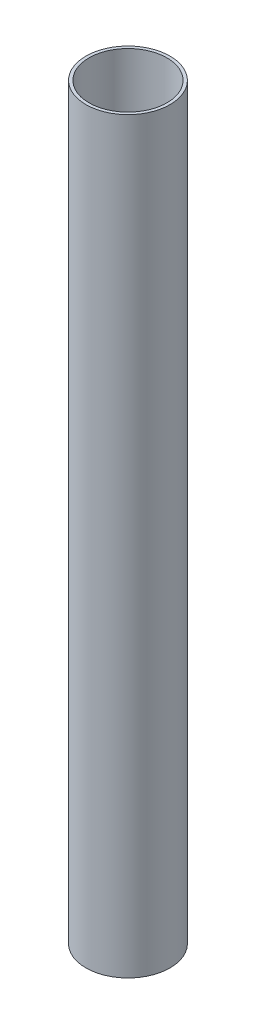
ISO-10303-21;
HEADER;
FILE_DESCRIPTION(('STEP AP214'),'2;1');
FILE_NAME('part.step','',(''),(''),'','','');
FILE_SCHEMA(('AUTOMOTIVE_DESIGN { 1 0 10303 214 1 1 1 1 }'));
ENDSEC;
DATA;
#1=APPLICATION_CONTEXT('core data for automotive mechanical design processes');
#2=APPLICATION_PROTOCOL_DEFINITION('international standard','automotive_design',2000,#1);
#3=PRODUCT_CONTEXT('',#1,'mechanical');
#4=PRODUCT('Part','Part','',(#3));
#5=PRODUCT_RELATED_PRODUCT_CATEGORY('part','',(#4));
#6=PRODUCT_DEFINITION_FORMATION('','',#4);
#7=PRODUCT_DEFINITION_CONTEXT('part definition',#1,'design');
#8=PRODUCT_DEFINITION('design','',#6,#7);
#9=PRODUCT_DEFINITION_SHAPE('','',#8);
#10=(LENGTH_UNIT() NAMED_UNIT(*) SI_UNIT(.MILLI.,.METRE.));
#11=(NAMED_UNIT(*) PLANE_ANGLE_UNIT() SI_UNIT($,.RADIAN.));
#12=(NAMED_UNIT(*) SI_UNIT($,.STERADIAN.) SOLID_ANGLE_UNIT());
#13=UNCERTAINTY_MEASURE_WITH_UNIT(LENGTH_MEASURE(1.E-05),#10,'distance_accuracy_value','');
#14=(GEOMETRIC_REPRESENTATION_CONTEXT(3) GLOBAL_UNCERTAINTY_ASSIGNED_CONTEXT((#13)) GLOBAL_UNIT_ASSIGNED_CONTEXT((#10,
#11,#12)) REPRESENTATION_CONTEXT('',''));
#15=CARTESIAN_POINT('',(0.,0.,0.));
#16=DIRECTION('',(0.,0.,1.));
#17=DIRECTION('',(1.,0.,0.));
#18=AXIS2_PLACEMENT_3D('',#15,#16,#17);
#19=CARTESIAN_POINT('',(0.,489.,0.));
#20=DIRECTION('',(0.,1.,0.));
#21=DIRECTION('',(0.,0.,1.));
#22=AXIS2_PLACEMENT_3D('',#19,#20,#21);
#23=PLANE('',#22);
#24=CARTESIAN_POINT('',(0.,489.,0.));
#25=DIRECTION('',(0.,1.,0.));
#26=DIRECTION('',(0.,0.,1.));
#27=AXIS2_PLACEMENT_3D('',#24,#25,#26);
#28=CIRCLE('',#27,27.5);
#29=CARTESIAN_POINT('',(0.,489.,27.5));
#30=VERTEX_POINT('',#29);
#31=EDGE_CURVE('E10',#30,#30,#28,.T.);
#32=ORIENTED_EDGE('',*,*,#31,.T.);
#33=EDGE_LOOP('',(#32));
#34=FACE_BOUND('',#33,.T.);
#35=CARTESIAN_POINT('',(0.,489.,0.));
#36=DIRECTION('',(0.,1.,0.));
#37=DIRECTION('',(0.,0.,1.));
#38=AXIS2_PLACEMENT_3D('',#35,#36,#37);
#39=CIRCLE('',#38,25.5);
#40=CARTESIAN_POINT('',(0.,489.,25.5));
#41=VERTEX_POINT('',#40);
#42=EDGE_CURVE('E52',#41,#41,#39,.T.);
#43=ORIENTED_EDGE('',*,*,#42,.F.);
#44=EDGE_LOOP('',(#43));
#45=FACE_BOUND('',#44,.T.);
#46=ADVANCED_FACE('F41',(#34,#45),#23,.T.);
#47=CARTESIAN_POINT('',(0.,0.,0.));
#48=DIRECTION('',(0.,1.,0.));
#49=DIRECTION('',(0.,0.,1.));
#50=AXIS2_PLACEMENT_3D('',#47,#48,#49);
#51=PLANE('',#50);
#52=CARTESIAN_POINT('',(0.,0.,0.));
#53=DIRECTION('',(0.,1.,0.));
#54=DIRECTION('',(0.,0.,1.));
#55=AXIS2_PLACEMENT_3D('',#52,#53,#54);
#56=CIRCLE('',#55,27.5);
#57=CARTESIAN_POINT('',(0.,0.,27.5));
#58=VERTEX_POINT('',#57);
#59=EDGE_CURVE('E45',#58,#58,#56,.T.);
#60=ORIENTED_EDGE('',*,*,#59,.F.);
#61=EDGE_LOOP('',(#60));
#62=FACE_BOUND('',#61,.T.);
#63=CARTESIAN_POINT('',(0.,0.,0.));
#64=DIRECTION('',(0.,1.,0.));
#65=DIRECTION('',(0.,0.,1.));
#66=AXIS2_PLACEMENT_3D('',#63,#64,#65);
#67=CIRCLE('',#66,25.5);
#68=CARTESIAN_POINT('',(0.,0.,25.5));
#69=VERTEX_POINT('',#68);
#70=EDGE_CURVE('E54',#69,#69,#67,.T.);
#71=ORIENTED_EDGE('',*,*,#70,.T.);
#72=EDGE_LOOP('',(#71));
#73=FACE_BOUND('',#72,.T.);
#74=ADVANCED_FACE('F64',(#62,#73),#51,.F.);
#75=CARTESIAN_POINT('',(0.,489.,0.));
#76=DIRECTION('',(0.,-1.,0.));
#77=DIRECTION('',(0.,0.,-1.));
#78=AXIS2_PLACEMENT_3D('',#75,#76,#77);
#79=CYLINDRICAL_SURFACE('',#78,27.5);
#80=ORIENTED_EDGE('',*,*,#31,.F.);
#81=EDGE_LOOP('',(#80));
#82=FACE_BOUND('',#81,.T.);
#83=ORIENTED_EDGE('',*,*,#59,.T.);
#84=EDGE_LOOP('',(#83));
#85=FACE_BOUND('',#84,.T.);
#86=ADVANCED_FACE('F43',(#82,#85),#79,.T.);
#87=CARTESIAN_POINT('',(0.,489.,0.));
#88=DIRECTION('',(0.,-1.,0.));
#89=DIRECTION('',(0.,0.,-1.));
#90=AXIS2_PLACEMENT_3D('',#87,#88,#89);
#91=CYLINDRICAL_SURFACE('',#90,25.5);
#92=ORIENTED_EDGE('',*,*,#42,.T.);
#93=EDGE_LOOP('',(#92));
#94=FACE_BOUND('',#93,.T.);
#95=ORIENTED_EDGE('',*,*,#70,.F.);
#96=EDGE_LOOP('',(#95));
#97=FACE_BOUND('',#96,.T.);
#98=ADVANCED_FACE('F60',(#94,#97),#91,.F.);
#99=CLOSED_SHELL('',(#46,#74,#86,#98));
#100=MANIFOLD_SOLID_BREP('B2',#99);
#101=ADVANCED_BREP_SHAPE_REPRESENTATION('',(#18,#100),#14);
#102=SHAPE_DEFINITION_REPRESENTATION(#9,#101);
ENDSEC;
END-ISO-10303-21;
